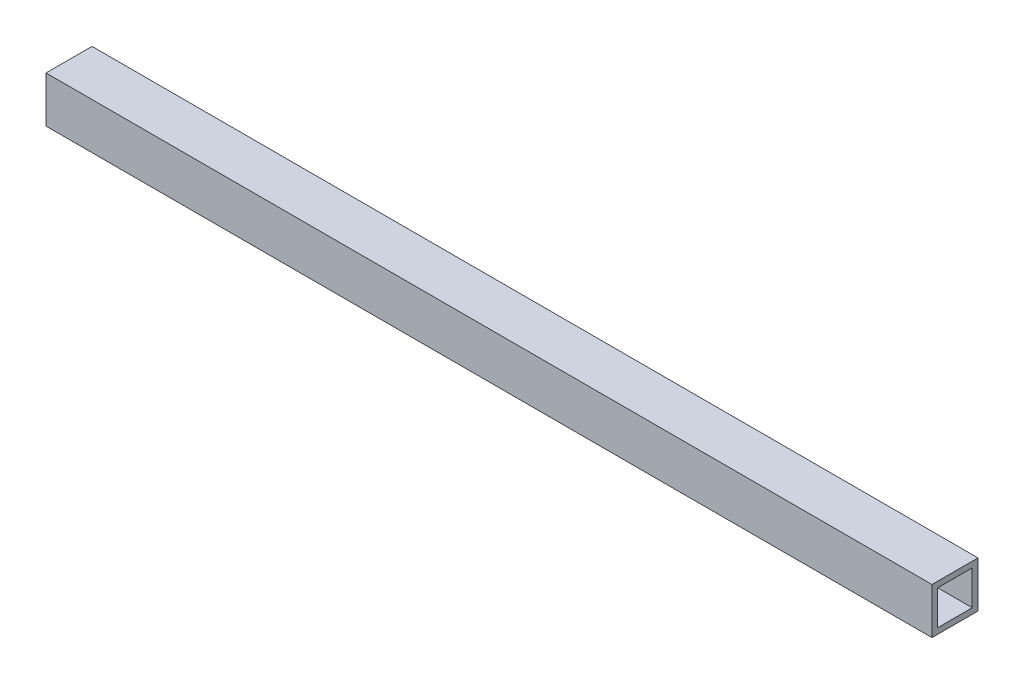
ISO-10303-21;
HEADER;
FILE_DESCRIPTION(('STEP AP214'),'2;1');
FILE_NAME('part.step','',(''),(''),'','','');
FILE_SCHEMA(('AUTOMOTIVE_DESIGN { 1 0 10303 214 1 1 1 1 }'));
ENDSEC;
DATA;
#1=APPLICATION_CONTEXT('core data for automotive mechanical design processes');
#2=APPLICATION_PROTOCOL_DEFINITION('international standard','automotive_design',2000,#1);
#3=PRODUCT_CONTEXT('',#1,'mechanical');
#4=PRODUCT('Part','Part','',(#3));
#5=PRODUCT_RELATED_PRODUCT_CATEGORY('part','',(#4));
#6=PRODUCT_DEFINITION_FORMATION('','',#4);
#7=PRODUCT_DEFINITION_CONTEXT('part definition',#1,'design');
#8=PRODUCT_DEFINITION('design','',#6,#7);
#9=PRODUCT_DEFINITION_SHAPE('','',#8);
#10=(LENGTH_UNIT() NAMED_UNIT(*) SI_UNIT(.MILLI.,.METRE.));
#11=(NAMED_UNIT(*) PLANE_ANGLE_UNIT() SI_UNIT($,.RADIAN.));
#12=(NAMED_UNIT(*) SI_UNIT($,.STERADIAN.) SOLID_ANGLE_UNIT());
#13=UNCERTAINTY_MEASURE_WITH_UNIT(LENGTH_MEASURE(1.E-05),#10,'distance_accuracy_value','');
#14=(GEOMETRIC_REPRESENTATION_CONTEXT(3) GLOBAL_UNCERTAINTY_ASSIGNED_CONTEXT((#13)) GLOBAL_UNIT_ASSIGNED_CONTEXT((#10,
#11,#12)) REPRESENTATION_CONTEXT('',''));
#15=CARTESIAN_POINT('',(0.,0.,0.));
#16=DIRECTION('',(0.,0.,1.));
#17=DIRECTION('',(1.,0.,0.));
#18=AXIS2_PLACEMENT_3D('',#15,#16,#17);
#19=CARTESIAN_POINT('',(244.475,0.,0.));
#20=DIRECTION('',(1.,0.,0.));
#21=DIRECTION('',(0.,0.,-1.));
#22=AXIS2_PLACEMENT_3D('',#19,#20,#21);
#23=PLANE('',#22);
#24=DIRECTION('',(0.,1.,0.));
#25=VECTOR('',#24,1.);
#26=CARTESIAN_POINT('',(244.475,-12.7,-12.7));
#27=LINE('',#26,#25);
#28=CARTESIAN_POINT('',(244.475,-12.7,-12.7));
#29=VERTEX_POINT('',#28);
#30=CARTESIAN_POINT('',(244.475,12.7,-12.7));
#31=VERTEX_POINT('',#30);
#32=EDGE_CURVE('E135',#29,#31,#27,.T.);
#33=ORIENTED_EDGE('',*,*,#32,.T.);
#34=DIRECTION('',(0.,0.,1.));
#35=VECTOR('',#34,1.);
#36=CARTESIAN_POINT('',(244.475,12.7,-12.7));
#37=LINE('',#36,#35);
#38=CARTESIAN_POINT('',(244.475,12.7,12.7));
#39=VERTEX_POINT('',#38);
#40=EDGE_CURVE('E138',#31,#39,#37,.T.);
#41=ORIENTED_EDGE('',*,*,#40,.T.);
#42=DIRECTION('',(0.,-1.,0.));
#43=VECTOR('',#42,1.);
#44=CARTESIAN_POINT('',(244.475,-12.7,12.7));
#45=LINE('',#44,#43);
#46=CARTESIAN_POINT('',(244.475,-12.7,12.7));
#47=VERTEX_POINT('',#46);
#48=EDGE_CURVE('E141',#39,#47,#45,.T.);
#49=ORIENTED_EDGE('',*,*,#48,.T.);
#50=DIRECTION('',(0.,0.,-1.));
#51=VECTOR('',#50,1.);
#52=CARTESIAN_POINT('',(244.475,-12.7,-12.7));
#53=LINE('',#52,#51);
#54=EDGE_CURVE('E143',#47,#29,#53,.T.);
#55=ORIENTED_EDGE('',*,*,#54,.T.);
#56=EDGE_LOOP('',(#33,#41,#49,#55));
#57=FACE_BOUND('',#56,.T.);
#58=DIRECTION('',(0.,0.,-1.));
#59=VECTOR('',#58,1.);
#60=CARTESIAN_POINT('',(244.475,-9.525,-9.525));
#61=LINE('',#60,#59);
#62=CARTESIAN_POINT('',(244.475,-9.525,9.525));
#63=VERTEX_POINT('',#62);
#64=CARTESIAN_POINT('',(244.475,-9.525,-9.525));
#65=VERTEX_POINT('',#64);
#66=EDGE_CURVE('E107',#63,#65,#61,.T.);
#67=ORIENTED_EDGE('',*,*,#66,.F.);
#68=DIRECTION('',(0.,-1.,0.));
#69=VECTOR('',#68,1.);
#70=CARTESIAN_POINT('',(244.475,-9.525,9.525));
#71=LINE('',#70,#69);
#72=CARTESIAN_POINT('',(244.475,9.52499999999999,9.525));
#73=VERTEX_POINT('',#72);
#74=EDGE_CURVE('E99',#73,#63,#71,.T.);
#75=ORIENTED_EDGE('',*,*,#74,.F.);
#76=DIRECTION('',(0.,0.,1.));
#77=VECTOR('',#76,1.);
#78=CARTESIAN_POINT('',(244.475,9.52499999999999,-9.525));
#79=LINE('',#78,#77);
#80=CARTESIAN_POINT('',(244.475,9.52499999999999,-9.525));
#81=VERTEX_POINT('',#80);
#82=EDGE_CURVE('E121',#81,#73,#79,.T.);
#83=ORIENTED_EDGE('',*,*,#82,.F.);
#84=DIRECTION('',(0.,1.,0.));
#85=VECTOR('',#84,1.);
#86=CARTESIAN_POINT('',(244.475,-9.525,-9.525));
#87=LINE('',#86,#85);
#88=EDGE_CURVE('E119',#65,#81,#87,.T.);
#89=ORIENTED_EDGE('',*,*,#88,.F.);
#90=EDGE_LOOP('',(#67,#75,#83,#89));
#91=FACE_BOUND('',#90,.T.);
#92=ADVANCED_FACE('F34',(#57,#91),#23,.T.);
#93=CARTESIAN_POINT('',(-244.475,0.,0.));
#94=DIRECTION('',(1.,0.,0.));
#95=DIRECTION('',(0.,0.,-1.));
#96=AXIS2_PLACEMENT_3D('',#93,#94,#95);
#97=PLANE('',#96);
#98=DIRECTION('',(0.,1.,0.));
#99=VECTOR('',#98,1.);
#100=CARTESIAN_POINT('',(-244.475,-12.7,-12.7));
#101=LINE('',#100,#99);
#102=CARTESIAN_POINT('',(-244.475,-12.7,-12.7));
#103=VERTEX_POINT('',#102);
#104=CARTESIAN_POINT('',(-244.475,12.7,-12.7));
#105=VERTEX_POINT('',#104);
#106=EDGE_CURVE('E115',#103,#105,#101,.T.);
#107=ORIENTED_EDGE('',*,*,#106,.F.);
#108=DIRECTION('',(0.,0.,-1.));
#109=VECTOR('',#108,1.);
#110=CARTESIAN_POINT('',(-244.475,-12.7,-12.7));
#111=LINE('',#110,#109);
#112=CARTESIAN_POINT('',(-244.475,-12.7,12.7));
#113=VERTEX_POINT('',#112);
#114=EDGE_CURVE('E139',#113,#103,#111,.T.);
#115=ORIENTED_EDGE('',*,*,#114,.F.);
#116=DIRECTION('',(0.,-1.,0.));
#117=VECTOR('',#116,1.);
#118=CARTESIAN_POINT('',(-244.475,-12.7,12.7));
#119=LINE('',#118,#117);
#120=CARTESIAN_POINT('',(-244.475,12.7,12.7));
#121=VERTEX_POINT('',#120);
#122=EDGE_CURVE('E150',#121,#113,#119,.T.);
#123=ORIENTED_EDGE('',*,*,#122,.F.);
#124=DIRECTION('',(0.,0.,1.));
#125=VECTOR('',#124,1.);
#126=CARTESIAN_POINT('',(-244.475,12.7,-12.7));
#127=LINE('',#126,#125);
#128=EDGE_CURVE('E148',#105,#121,#127,.T.);
#129=ORIENTED_EDGE('',*,*,#128,.F.);
#130=EDGE_LOOP('',(#107,#115,#123,#129));
#131=FACE_BOUND('',#130,.T.);
#132=DIRECTION('',(0.,-1.,0.));
#133=VECTOR('',#132,1.);
#134=CARTESIAN_POINT('',(-244.475,-9.525,9.525));
#135=LINE('',#134,#133);
#136=CARTESIAN_POINT('',(-244.475,9.52499999999999,9.525));
#137=VERTEX_POINT('',#136);
#138=CARTESIAN_POINT('',(-244.475,-9.525,9.525));
#139=VERTEX_POINT('',#138);
#140=EDGE_CURVE('E57',#137,#139,#135,.T.);
#141=ORIENTED_EDGE('',*,*,#140,.T.);
#142=DIRECTION('',(0.,0.,-1.));
#143=VECTOR('',#142,1.);
#144=CARTESIAN_POINT('',(-244.475,-9.525,-9.525));
#145=LINE('',#144,#143);
#146=CARTESIAN_POINT('',(-244.475,-9.525,-9.525));
#147=VERTEX_POINT('',#146);
#148=EDGE_CURVE('E114',#139,#147,#145,.T.);
#149=ORIENTED_EDGE('',*,*,#148,.T.);
#150=DIRECTION('',(0.,1.,0.));
#151=VECTOR('',#150,1.);
#152=CARTESIAN_POINT('',(-244.475,-9.525,-9.525));
#153=LINE('',#152,#151);
#154=CARTESIAN_POINT('',(-244.475,9.52499999999999,-9.525));
#155=VERTEX_POINT('',#154);
#156=EDGE_CURVE('E127',#147,#155,#153,.T.);
#157=ORIENTED_EDGE('',*,*,#156,.T.);
#158=DIRECTION('',(0.,0.,1.));
#159=VECTOR('',#158,1.);
#160=CARTESIAN_POINT('',(-244.475,9.52499999999999,-9.525));
#161=LINE('',#160,#159);
#162=EDGE_CURVE('E108',#155,#137,#161,.T.);
#163=ORIENTED_EDGE('',*,*,#162,.T.);
#164=EDGE_LOOP('',(#141,#149,#157,#163));
#165=FACE_BOUND('',#164,.T.);
#166=ADVANCED_FACE('F168',(#131,#165),#97,.F.);
#167=CARTESIAN_POINT('',(244.475,-12.7,-12.7));
#168=DIRECTION('',(0.,0.,1.));
#169=DIRECTION('',(1.,0.,0.));
#170=AXIS2_PLACEMENT_3D('',#167,#168,#169);
#171=PLANE('',#170);
#172=ORIENTED_EDGE('',*,*,#106,.T.);
#173=DIRECTION('',(-1.,0.,0.));
#174=VECTOR('',#173,1.);
#175=CARTESIAN_POINT('',(244.475,12.7,-12.7));
#176=LINE('',#175,#174);
#177=EDGE_CURVE('E11',#31,#105,#176,.T.);
#178=ORIENTED_EDGE('',*,*,#177,.F.);
#179=ORIENTED_EDGE('',*,*,#32,.F.);
#180=DIRECTION('',(-1.,0.,0.));
#181=VECTOR('',#180,1.);
#182=CARTESIAN_POINT('',(244.475,-12.7,-12.7));
#183=LINE('',#182,#181);
#184=EDGE_CURVE('E145',#29,#103,#183,.T.);
#185=ORIENTED_EDGE('',*,*,#184,.T.);
#186=EDGE_LOOP('',(#172,#178,#179,#185));
#187=FACE_BOUND('',#186,.T.);
#188=ADVANCED_FACE('F36',(#187),#171,.F.);
#189=CARTESIAN_POINT('',(244.475,12.7,-12.7));
#190=DIRECTION('',(0.,-1.,0.));
#191=DIRECTION('',(0.,0.,-1.));
#192=AXIS2_PLACEMENT_3D('',#189,#190,#191);
#193=PLANE('',#192);
#194=ORIENTED_EDGE('',*,*,#128,.T.);
#195=DIRECTION('',(-1.,0.,0.));
#196=VECTOR('',#195,1.);
#197=CARTESIAN_POINT('',(244.475,12.7,12.7));
#198=LINE('',#197,#196);
#199=EDGE_CURVE('E42',#39,#121,#198,.T.);
#200=ORIENTED_EDGE('',*,*,#199,.F.);
#201=ORIENTED_EDGE('',*,*,#40,.F.);
#202=ORIENTED_EDGE('',*,*,#177,.T.);
#203=EDGE_LOOP('',(#194,#200,#201,#202));
#204=FACE_BOUND('',#203,.T.);
#205=ADVANCED_FACE('F178',(#204),#193,.F.);
#206=CARTESIAN_POINT('',(244.475,-12.7,12.7));
#207=DIRECTION('',(0.,0.,-1.));
#208=DIRECTION('',(-1.,0.,0.));
#209=AXIS2_PLACEMENT_3D('',#206,#207,#208);
#210=PLANE('',#209);
#211=ORIENTED_EDGE('',*,*,#122,.T.);
#212=DIRECTION('',(-1.,0.,0.));
#213=VECTOR('',#212,1.);
#214=CARTESIAN_POINT('',(244.475,-12.7,12.7));
#215=LINE('',#214,#213);
#216=EDGE_CURVE('E155',#47,#113,#215,.T.);
#217=ORIENTED_EDGE('',*,*,#216,.F.);
#218=ORIENTED_EDGE('',*,*,#48,.F.);
#219=ORIENTED_EDGE('',*,*,#199,.T.);
#220=EDGE_LOOP('',(#211,#217,#218,#219));
#221=FACE_BOUND('',#220,.T.);
#222=ADVANCED_FACE('F162',(#221),#210,.F.);
#223=CARTESIAN_POINT('',(244.475,-12.7,-12.7));
#224=DIRECTION('',(0.,1.,0.));
#225=DIRECTION('',(0.,0.,1.));
#226=AXIS2_PLACEMENT_3D('',#223,#224,#225);
#227=PLANE('',#226);
#228=ORIENTED_EDGE('',*,*,#114,.T.);
#229=ORIENTED_EDGE('',*,*,#184,.F.);
#230=ORIENTED_EDGE('',*,*,#54,.F.);
#231=ORIENTED_EDGE('',*,*,#216,.T.);
#232=EDGE_LOOP('',(#228,#229,#230,#231));
#233=FACE_BOUND('',#232,.T.);
#234=ADVANCED_FACE('F172',(#233),#227,.F.);
#235=CARTESIAN_POINT('',(244.475,-9.525,9.525));
#236=DIRECTION('',(0.,0.,-1.));
#237=DIRECTION('',(0.,1.,0.));
#238=AXIS2_PLACEMENT_3D('',#235,#236,#237);
#239=PLANE('',#238);
#240=ORIENTED_EDGE('',*,*,#140,.F.);
#241=DIRECTION('',(-1.,0.,0.));
#242=VECTOR('',#241,1.);
#243=CARTESIAN_POINT('',(244.475,9.52499999999999,9.525));
#244=LINE('',#243,#242);
#245=EDGE_CURVE('E103',#73,#137,#244,.T.);
#246=ORIENTED_EDGE('',*,*,#245,.F.);
#247=ORIENTED_EDGE('',*,*,#74,.T.);
#248=DIRECTION('',(-1.,0.,0.));
#249=VECTOR('',#248,1.);
#250=CARTESIAN_POINT('',(244.475,-9.525,9.525));
#251=LINE('',#250,#249);
#252=EDGE_CURVE('E102',#63,#139,#251,.T.);
#253=ORIENTED_EDGE('',*,*,#252,.T.);
#254=EDGE_LOOP('',(#240,#246,#247,#253));
#255=FACE_BOUND('',#254,.T.);
#256=ADVANCED_FACE('F101',(#255),#239,.T.);
#257=CARTESIAN_POINT('',(244.475,-9.525,-9.525));
#258=DIRECTION('',(0.,1.,0.));
#259=DIRECTION('',(0.,0.,1.));
#260=AXIS2_PLACEMENT_3D('',#257,#258,#259);
#261=PLANE('',#260);
#262=ORIENTED_EDGE('',*,*,#148,.F.);
#263=ORIENTED_EDGE('',*,*,#252,.F.);
#264=ORIENTED_EDGE('',*,*,#66,.T.);
#265=DIRECTION('',(-1.,0.,0.));
#266=VECTOR('',#265,1.);
#267=CARTESIAN_POINT('',(244.475,-9.525,-9.525));
#268=LINE('',#267,#266);
#269=EDGE_CURVE('E116',#65,#147,#268,.T.);
#270=ORIENTED_EDGE('',*,*,#269,.T.);
#271=EDGE_LOOP('',(#262,#263,#264,#270));
#272=FACE_BOUND('',#271,.T.);
#273=ADVANCED_FACE('F111',(#272),#261,.T.);
#274=CARTESIAN_POINT('',(244.475,-9.525,-9.525));
#275=DIRECTION('',(0.,0.,1.));
#276=DIRECTION('',(1.,0.,0.));
#277=AXIS2_PLACEMENT_3D('',#274,#275,#276);
#278=PLANE('',#277);
#279=ORIENTED_EDGE('',*,*,#156,.F.);
#280=ORIENTED_EDGE('',*,*,#269,.F.);
#281=ORIENTED_EDGE('',*,*,#88,.T.);
#282=DIRECTION('',(-1.,0.,0.));
#283=VECTOR('',#282,1.);
#284=CARTESIAN_POINT('',(244.475,9.52499999999999,-9.525));
#285=LINE('',#284,#283);
#286=EDGE_CURVE('E49',#81,#155,#285,.T.);
#287=ORIENTED_EDGE('',*,*,#286,.T.);
#288=EDGE_LOOP('',(#279,#280,#281,#287));
#289=FACE_BOUND('',#288,.T.);
#290=ADVANCED_FACE('F201',(#289),#278,.T.);
#291=CARTESIAN_POINT('',(244.475,9.52499999999999,-9.525));
#292=DIRECTION('',(0.,-1.,0.));
#293=DIRECTION('',(0.,0.,-1.));
#294=AXIS2_PLACEMENT_3D('',#291,#292,#293);
#295=PLANE('',#294);
#296=ORIENTED_EDGE('',*,*,#162,.F.);
#297=ORIENTED_EDGE('',*,*,#286,.F.);
#298=ORIENTED_EDGE('',*,*,#82,.T.);
#299=ORIENTED_EDGE('',*,*,#245,.T.);
#300=EDGE_LOOP('',(#296,#297,#298,#299));
#301=FACE_BOUND('',#300,.T.);
#302=ADVANCED_FACE('F205',(#301),#295,.T.);
#303=CLOSED_SHELL('',(#92,#166,#188,#205,#222,#234,#256,#273,#290,#302));
#304=MANIFOLD_SOLID_BREP('B2',#303);
#305=ADVANCED_BREP_SHAPE_REPRESENTATION('',(#18,#304),#14);
#306=SHAPE_DEFINITION_REPRESENTATION(#9,#305);
ENDSEC;
END-ISO-10303-21;
